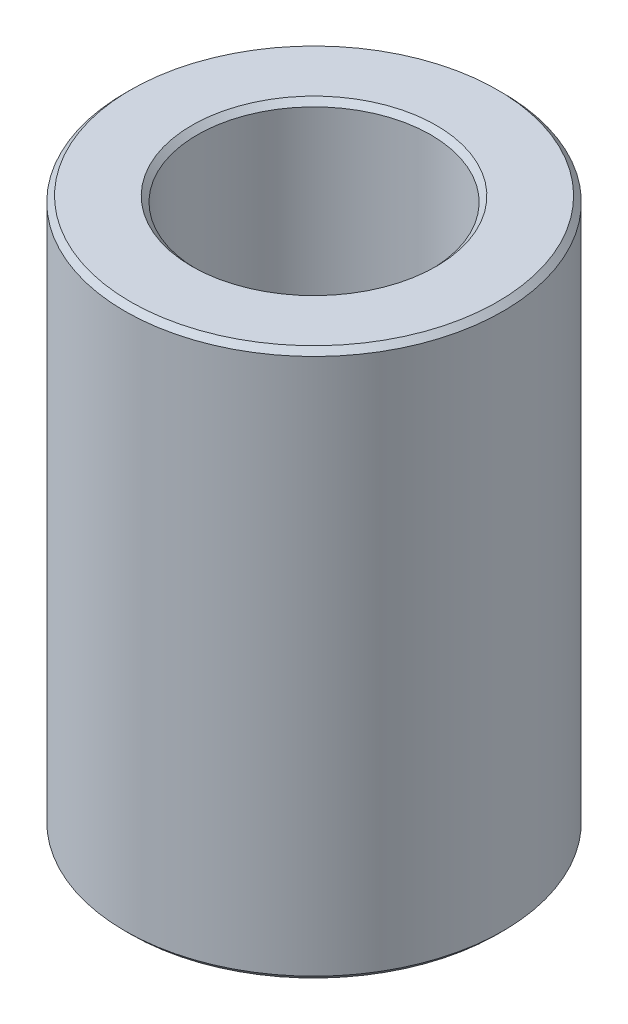
ISO-10303-21;
HEADER;
FILE_DESCRIPTION(('STEP AP214'),'2;1');
FILE_NAME('part.step','',(''),(''),'','','');
FILE_SCHEMA(('AUTOMOTIVE_DESIGN { 1 0 10303 214 1 1 1 1 }'));
ENDSEC;
DATA;
#1=APPLICATION_CONTEXT('core data for automotive mechanical design processes');
#2=APPLICATION_PROTOCOL_DEFINITION('international standard','automotive_design',2000,#1);
#3=PRODUCT_CONTEXT('',#1,'mechanical');
#4=PRODUCT('Part','Part','',(#3));
#5=PRODUCT_RELATED_PRODUCT_CATEGORY('part','',(#4));
#6=PRODUCT_DEFINITION_FORMATION('','',#4);
#7=PRODUCT_DEFINITION_CONTEXT('part definition',#1,'design');
#8=PRODUCT_DEFINITION('design','',#6,#7);
#9=PRODUCT_DEFINITION_SHAPE('','',#8);
#10=(LENGTH_UNIT() NAMED_UNIT(*) SI_UNIT(.MILLI.,.METRE.));
#11=(NAMED_UNIT(*) PLANE_ANGLE_UNIT() SI_UNIT($,.RADIAN.));
#12=(NAMED_UNIT(*) SI_UNIT($,.STERADIAN.) SOLID_ANGLE_UNIT());
#13=UNCERTAINTY_MEASURE_WITH_UNIT(LENGTH_MEASURE(1.E-05),#10,'distance_accuracy_value','');
#14=(GEOMETRIC_REPRESENTATION_CONTEXT(3) GLOBAL_UNCERTAINTY_ASSIGNED_CONTEXT((#13)) GLOBAL_UNIT_ASSIGNED_CONTEXT((#10,
#11,#12)) REPRESENTATION_CONTEXT('',''));
#15=CARTESIAN_POINT('',(0.,0.,0.));
#16=DIRECTION('',(0.,0.,1.));
#17=DIRECTION('',(1.,0.,0.));
#18=AXIS2_PLACEMENT_3D('',#15,#16,#17);
#19=CARTESIAN_POINT('',(0.,12.51,0.));
#20=DIRECTION('',(0.,1.,0.));
#21=DIRECTION('',(0.,0.,1.));
#22=AXIS2_PLACEMENT_3D('',#19,#20,#21);
#23=PLANE('',#22);
#24=CARTESIAN_POINT('',(0.,12.51,0.));
#25=DIRECTION('',(0.,1.,0.));
#26=DIRECTION('',(0.,0.,1.));
#27=AXIS2_PLACEMENT_3D('',#24,#25,#26);
#28=CIRCLE('',#27,5.584);
#29=CARTESIAN_POINT('',(0.,12.51,5.584));
#30=VERTEX_POINT('',#29);
#31=EDGE_CURVE('E11',#30,#30,#28,.F.);
#32=ORIENTED_EDGE('',*,*,#31,.T.);
#33=EDGE_LOOP('',(#32));
#34=FACE_BOUND('',#33,.T.);
#35=CARTESIAN_POINT('',(0.,12.51,0.));
#36=DIRECTION('',(0.,1.,0.));
#37=DIRECTION('',(0.,0.,1.));
#38=AXIS2_PLACEMENT_3D('',#35,#36,#37);
#39=CIRCLE('',#38,8.38599999999999);
#40=CARTESIAN_POINT('',(0.,12.51,8.38599999999999));
#41=VERTEX_POINT('',#40);
#42=EDGE_CURVE('E41',#41,#41,#39,.T.);
#43=ORIENTED_EDGE('',*,*,#42,.T.);
#44=EDGE_LOOP('',(#43));
#45=FACE_BOUND('',#44,.T.);
#46=ADVANCED_FACE('F34',(#34,#45),#23,.T.);
#47=CARTESIAN_POINT('',(0.,-12.51,0.));
#48=DIRECTION('',(0.,1.,0.));
#49=DIRECTION('',(0.,0.,1.));
#50=AXIS2_PLACEMENT_3D('',#47,#48,#49);
#51=PLANE('',#50);
#52=CARTESIAN_POINT('',(0.,-12.51,0.));
#53=DIRECTION('',(0.,1.,0.));
#54=DIRECTION('',(0.,0.,1.));
#55=AXIS2_PLACEMENT_3D('',#52,#53,#54);
#56=CIRCLE('',#55,5.584);
#57=CARTESIAN_POINT('',(0.,-12.51,5.584));
#58=VERTEX_POINT('',#57);
#59=EDGE_CURVE('E60',#58,#58,#56,.T.);
#60=ORIENTED_EDGE('',*,*,#59,.T.);
#61=EDGE_LOOP('',(#60));
#62=FACE_BOUND('',#61,.T.);
#63=CARTESIAN_POINT('',(0.,-12.51,0.));
#64=DIRECTION('',(0.,1.,0.));
#65=DIRECTION('',(0.,0.,1.));
#66=AXIS2_PLACEMENT_3D('',#63,#64,#65);
#67=CIRCLE('',#66,8.386);
#68=CARTESIAN_POINT('',(0.,-12.51,8.386));
#69=VERTEX_POINT('',#68);
#70=EDGE_CURVE('E63',#69,#69,#67,.F.);
#71=ORIENTED_EDGE('',*,*,#70,.T.);
#72=EDGE_LOOP('',(#71));
#73=FACE_BOUND('',#72,.T.);
#74=ADVANCED_FACE('F67',(#62,#73),#51,.F.);
#75=CARTESIAN_POINT('',(0.,12.51,0.));
#76=DIRECTION('',(0.,-1.,0.));
#77=DIRECTION('',(0.,0.,-1.));
#78=AXIS2_PLACEMENT_3D('',#75,#76,#77);
#79=CYLINDRICAL_SURFACE('',#78,8.636);
#80=CARTESIAN_POINT('',(0.,-12.26,0.));
#81=DIRECTION('',(0.,1.,0.));
#82=DIRECTION('',(0.,0.,1.));
#83=AXIS2_PLACEMENT_3D('',#80,#81,#82);
#84=CIRCLE('',#83,8.636);
#85=CARTESIAN_POINT('',(0.,-12.26,8.636));
#86=VERTEX_POINT('',#85);
#87=EDGE_CURVE('E45',#86,#86,#84,.T.);
#88=ORIENTED_EDGE('',*,*,#87,.T.);
#89=EDGE_LOOP('',(#88));
#90=FACE_BOUND('',#89,.T.);
#91=CARTESIAN_POINT('',(0.,12.26,0.));
#92=DIRECTION('',(0.,1.,0.));
#93=DIRECTION('',(0.,0.,1.));
#94=AXIS2_PLACEMENT_3D('',#91,#92,#93);
#95=CIRCLE('',#94,8.636);
#96=CARTESIAN_POINT('',(0.,12.26,8.636));
#97=VERTEX_POINT('',#96);
#98=EDGE_CURVE('E49',#97,#97,#95,.F.);
#99=ORIENTED_EDGE('',*,*,#98,.T.);
#100=EDGE_LOOP('',(#99));
#101=FACE_BOUND('',#100,.T.);
#102=ADVANCED_FACE('F77',(#90,#101),#79,.T.);
#103=CARTESIAN_POINT('',(0.,12.51,0.));
#104=DIRECTION('',(0.,-1.,0.));
#105=DIRECTION('',(0.,0.,-1.));
#106=AXIS2_PLACEMENT_3D('',#103,#104,#105);
#107=CYLINDRICAL_SURFACE('',#106,5.334);
#108=CARTESIAN_POINT('',(0.,-12.26,0.));
#109=DIRECTION('',(0.,1.,0.));
#110=DIRECTION('',(0.,0.,1.));
#111=AXIS2_PLACEMENT_3D('',#108,#109,#110);
#112=CIRCLE('',#111,5.334);
#113=CARTESIAN_POINT('',(0.,-12.26,5.334));
#114=VERTEX_POINT('',#113);
#115=EDGE_CURVE('E54',#114,#114,#112,.F.);
#116=ORIENTED_EDGE('',*,*,#115,.T.);
#117=EDGE_LOOP('',(#116));
#118=FACE_BOUND('',#117,.T.);
#119=CARTESIAN_POINT('',(0.,12.26,0.));
#120=DIRECTION('',(0.,1.,0.));
#121=DIRECTION('',(0.,0.,1.));
#122=AXIS2_PLACEMENT_3D('',#119,#120,#121);
#123=CIRCLE('',#122,5.334);
#124=CARTESIAN_POINT('',(0.,12.26,5.334));
#125=VERTEX_POINT('',#124);
#126=EDGE_CURVE('E57',#125,#125,#123,.T.);
#127=ORIENTED_EDGE('',*,*,#126,.T.);
#128=EDGE_LOOP('',(#127));
#129=FACE_BOUND('',#128,.T.);
#130=ADVANCED_FACE('F80',(#118,#129),#107,.F.);
#131=CARTESIAN_POINT('',(0.,-12.51,0.));
#132=DIRECTION('',(0.,-1.,0.));
#133=DIRECTION('',(0.,0.,-1.));
#134=AXIS2_PLACEMENT_3D('',#131,#132,#133);
#135=CONICAL_SURFACE('',#134,5.584,0.785398163397447);
#136=ORIENTED_EDGE('',*,*,#115,.F.);
#137=EDGE_LOOP('',(#136));
#138=FACE_BOUND('',#137,.T.);
#139=ORIENTED_EDGE('',*,*,#59,.F.);
#140=EDGE_LOOP('',(#139));
#141=FACE_BOUND('',#140,.T.);
#142=ADVANCED_FACE('F73',(#138,#141),#135,.F.);
#143=CARTESIAN_POINT('',(0.,-12.26,0.));
#144=DIRECTION('',(0.,1.,0.));
#145=DIRECTION('',(0.,0.,1.));
#146=AXIS2_PLACEMENT_3D('',#143,#144,#145);
#147=CONICAL_SURFACE('',#146,8.636,0.785398163397452);
#148=ORIENTED_EDGE('',*,*,#70,.F.);
#149=EDGE_LOOP('',(#148));
#150=FACE_BOUND('',#149,.T.);
#151=ORIENTED_EDGE('',*,*,#87,.F.);
#152=EDGE_LOOP('',(#151));
#153=FACE_BOUND('',#152,.T.);
#154=ADVANCED_FACE('F69',(#150,#153),#147,.T.);
#155=CARTESIAN_POINT('',(0.,12.26,0.));
#156=DIRECTION('',(0.,1.,0.));
#157=DIRECTION('',(0.,0.,1.));
#158=AXIS2_PLACEMENT_3D('',#155,#156,#157);
#159=CONICAL_SURFACE('',#158,5.334,0.785398163397457);
#160=ORIENTED_EDGE('',*,*,#31,.F.);
#161=EDGE_LOOP('',(#160));
#162=FACE_BOUND('',#161,.T.);
#163=ORIENTED_EDGE('',*,*,#126,.F.);
#164=EDGE_LOOP('',(#163));
#165=FACE_BOUND('',#164,.T.);
#166=ADVANCED_FACE('F72',(#162,#165),#159,.F.);
#167=CARTESIAN_POINT('',(0.,12.51,0.));
#168=DIRECTION('',(0.,-1.,0.));
#169=DIRECTION('',(0.,0.,-1.));
#170=AXIS2_PLACEMENT_3D('',#167,#168,#169);
#171=CONICAL_SURFACE('',#170,8.38599999999999,0.785398163397438);
#172=ORIENTED_EDGE('',*,*,#98,.F.);
#173=EDGE_LOOP('',(#172));
#174=FACE_BOUND('',#173,.T.);
#175=ORIENTED_EDGE('',*,*,#42,.F.);
#176=EDGE_LOOP('',(#175));
#177=FACE_BOUND('',#176,.T.);
#178=ADVANCED_FACE('F36',(#174,#177),#171,.T.);
#179=CLOSED_SHELL('',(#46,#74,#102,#130,#142,#154,#166,#178));
#180=MANIFOLD_SOLID_BREP('B2',#179);
#181=ADVANCED_BREP_SHAPE_REPRESENTATION('',(#18,#180),#14);
#182=SHAPE_DEFINITION_REPRESENTATION(#9,#181);
ENDSEC;
END-ISO-10303-21;
